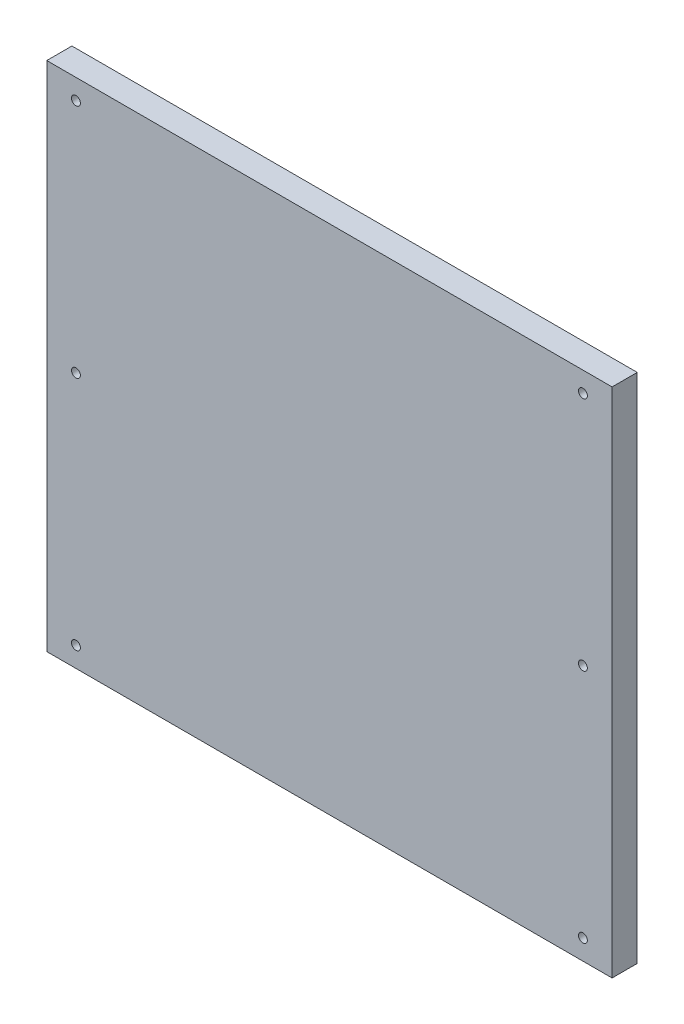
ISO-10303-21;
HEADER;
FILE_DESCRIPTION(('STEP AP214'),'2;1');
FILE_NAME('part.step','',(''),(''),'','','');
FILE_SCHEMA(('AUTOMOTIVE_DESIGN { 1 0 10303 214 1 1 1 1 }'));
ENDSEC;
DATA;
#1=APPLICATION_CONTEXT('core data for automotive mechanical design processes');
#2=APPLICATION_PROTOCOL_DEFINITION('international standard','automotive_design',2000,#1);
#3=PRODUCT_CONTEXT('',#1,'mechanical');
#4=PRODUCT('Part','Part','',(#3));
#5=PRODUCT_RELATED_PRODUCT_CATEGORY('part','',(#4));
#6=PRODUCT_DEFINITION_FORMATION('','',#4);
#7=PRODUCT_DEFINITION_CONTEXT('part definition',#1,'design');
#8=PRODUCT_DEFINITION('design','',#6,#7);
#9=PRODUCT_DEFINITION_SHAPE('','',#8);
#10=(LENGTH_UNIT() NAMED_UNIT(*) SI_UNIT(.MILLI.,.METRE.));
#11=(NAMED_UNIT(*) PLANE_ANGLE_UNIT() SI_UNIT($,.RADIAN.));
#12=(NAMED_UNIT(*) SI_UNIT($,.STERADIAN.) SOLID_ANGLE_UNIT());
#13=UNCERTAINTY_MEASURE_WITH_UNIT(LENGTH_MEASURE(1.E-05),#10,'distance_accuracy_value','');
#14=(GEOMETRIC_REPRESENTATION_CONTEXT(3) GLOBAL_UNCERTAINTY_ASSIGNED_CONTEXT((#13)) GLOBAL_UNIT_ASSIGNED_CONTEXT((#10,
#11,#12)) REPRESENTATION_CONTEXT('',''));
#15=CARTESIAN_POINT('',(0.,0.,0.));
#16=DIRECTION('',(0.,0.,1.));
#17=DIRECTION('',(1.,0.,0.));
#18=AXIS2_PLACEMENT_3D('',#15,#16,#17);
#19=CARTESIAN_POINT('',(214.1125,-146.250000000001,1082.67499999999));
#20=DIRECTION('',(-1.,0.,0.));
#21=DIRECTION('',(0.,0.,1.));
#22=AXIS2_PLACEMENT_3D('',#19,#20,#21);
#23=PLANE('',#22);
#24=DIRECTION('',(0.,1.,0.));
#25=VECTOR('',#24,1.);
#26=CARTESIAN_POINT('',(214.1125,-146.250000000001,1063.62499999999));
#27=LINE('',#26,#25);
#28=CARTESIAN_POINT('',(214.1125,-146.250000000001,1063.62499999999));
#29=VERTEX_POINT('',#28);
#30=CARTESIAN_POINT('',(214.1125,241.5,1063.62499999999));
#31=VERTEX_POINT('',#30);
#32=EDGE_CURVE('E103',#29,#31,#27,.T.);
#33=ORIENTED_EDGE('',*,*,#32,.T.);
#34=DIRECTION('',(0.,0.,-1.));
#35=VECTOR('',#34,1.);
#36=CARTESIAN_POINT('',(214.1125,241.5,1082.67499999999));
#37=LINE('',#36,#35);
#38=CARTESIAN_POINT('',(214.1125,241.5,1082.67499999999));
#39=VERTEX_POINT('',#38);
#40=EDGE_CURVE('E11',#39,#31,#37,.T.);
#41=ORIENTED_EDGE('',*,*,#40,.F.);
#42=DIRECTION('',(0.,1.,0.));
#43=VECTOR('',#42,1.);
#44=CARTESIAN_POINT('',(214.1125,-146.250000000001,1082.67499999999));
#45=LINE('',#44,#43);
#46=CARTESIAN_POINT('',(214.1125,-146.250000000001,1082.67499999999));
#47=VERTEX_POINT('',#46);
#48=EDGE_CURVE('E90',#47,#39,#45,.T.);
#49=ORIENTED_EDGE('',*,*,#48,.F.);
#50=DIRECTION('',(0.,0.,-1.));
#51=VECTOR('',#50,1.);
#52=CARTESIAN_POINT('',(214.1125,-146.250000000001,1082.67499999999));
#53=LINE('',#52,#51);
#54=EDGE_CURVE('E99',#47,#29,#53,.T.);
#55=ORIENTED_EDGE('',*,*,#54,.T.);
#56=EDGE_LOOP('',(#33,#41,#49,#55));
#57=FACE_BOUND('',#56,.T.);
#58=ADVANCED_FACE('F37',(#57),#23,.F.);
#59=CARTESIAN_POINT('',(214.1125,241.5,1082.67499999999));
#60=DIRECTION('',(0.,-1.,0.));
#61=DIRECTION('',(1.,0.,0.));
#62=AXIS2_PLACEMENT_3D('',#59,#60,#61);
#63=PLANE('',#62);
#64=DIRECTION('',(-1.,0.,0.));
#65=VECTOR('',#64,1.);
#66=CARTESIAN_POINT('',(214.1125,241.5,1063.62499999999));
#67=LINE('',#66,#65);
#68=CARTESIAN_POINT('',(-214.11249999999,241.5,1063.62499999999));
#69=VERTEX_POINT('',#68);
#70=EDGE_CURVE('E94',#31,#69,#67,.T.);
#71=ORIENTED_EDGE('',*,*,#70,.T.);
#72=DIRECTION('',(0.,0.,-1.));
#73=VECTOR('',#72,1.);
#74=CARTESIAN_POINT('',(-214.11249999999,241.5,1082.67499999999));
#75=LINE('',#74,#73);
#76=CARTESIAN_POINT('',(-214.11249999999,241.5,1082.67499999999));
#77=VERTEX_POINT('',#76);
#78=EDGE_CURVE('E46',#77,#69,#75,.T.);
#79=ORIENTED_EDGE('',*,*,#78,.F.);
#80=DIRECTION('',(-1.,0.,0.));
#81=VECTOR('',#80,1.);
#82=CARTESIAN_POINT('',(214.1125,241.5,1082.67499999999));
#83=LINE('',#82,#81);
#84=EDGE_CURVE('E85',#39,#77,#83,.T.);
#85=ORIENTED_EDGE('',*,*,#84,.F.);
#86=ORIENTED_EDGE('',*,*,#40,.T.);
#87=EDGE_LOOP('',(#71,#79,#85,#86));
#88=FACE_BOUND('',#87,.T.);
#89=ADVANCED_FACE('F93',(#88),#63,.F.);
#90=CARTESIAN_POINT('',(-214.112499999991,-146.250000000001,1082.67499999999));
#91=DIRECTION('',(1.,0.,0.));
#92=DIRECTION('',(0.,1.,0.));
#93=AXIS2_PLACEMENT_3D('',#90,#91,#92);
#94=PLANE('',#93);
#95=DIRECTION('',(0.,-1.,0.));
#96=VECTOR('',#95,1.);
#97=CARTESIAN_POINT('',(-214.112499999991,-146.250000000001,1063.62499999999));
#98=LINE('',#97,#96);
#99=CARTESIAN_POINT('',(-214.112499999991,-146.250000000001,1063.62499999999));
#100=VERTEX_POINT('',#99);
#101=EDGE_CURVE('E72',#69,#100,#98,.T.);
#102=ORIENTED_EDGE('',*,*,#101,.T.);
#103=DIRECTION('',(0.,0.,-1.));
#104=VECTOR('',#103,1.);
#105=CARTESIAN_POINT('',(-214.112499999991,-146.250000000001,1082.67499999999));
#106=LINE('',#105,#104);
#107=CARTESIAN_POINT('',(-214.112499999991,-146.250000000001,1082.67499999999));
#108=VERTEX_POINT('',#107);
#109=EDGE_CURVE('E95',#108,#100,#106,.T.);
#110=ORIENTED_EDGE('',*,*,#109,.F.);
#111=DIRECTION('',(0.,-1.,0.));
#112=VECTOR('',#111,1.);
#113=CARTESIAN_POINT('',(-214.112499999991,-146.250000000001,1082.67499999999));
#114=LINE('',#113,#112);
#115=EDGE_CURVE('E88',#77,#108,#114,.T.);
#116=ORIENTED_EDGE('',*,*,#115,.F.);
#117=ORIENTED_EDGE('',*,*,#78,.T.);
#118=EDGE_LOOP('',(#102,#110,#116,#117));
#119=FACE_BOUND('',#118,.T.);
#120=ADVANCED_FACE('F97',(#119),#94,.F.);
#121=CARTESIAN_POINT('',(214.1125,-146.250000000001,1082.67499999999));
#122=DIRECTION('',(0.,1.,0.));
#123=DIRECTION('',(-1.,0.,0.));
#124=AXIS2_PLACEMENT_3D('',#121,#122,#123);
#125=PLANE('',#124);
#126=DIRECTION('',(1.,0.,0.));
#127=VECTOR('',#126,1.);
#128=CARTESIAN_POINT('',(214.1125,-146.250000000001,1063.62499999999));
#129=LINE('',#128,#127);
#130=EDGE_CURVE('E78',#100,#29,#129,.T.);
#131=ORIENTED_EDGE('',*,*,#130,.T.);
#132=ORIENTED_EDGE('',*,*,#54,.F.);
#133=DIRECTION('',(1.,0.,0.));
#134=VECTOR('',#133,1.);
#135=CARTESIAN_POINT('',(214.1125,-146.250000000001,1082.67499999999));
#136=LINE('',#135,#134);
#137=EDGE_CURVE('E55',#108,#47,#136,.T.);
#138=ORIENTED_EDGE('',*,*,#137,.F.);
#139=ORIENTED_EDGE('',*,*,#109,.T.);
#140=EDGE_LOOP('',(#131,#132,#138,#139));
#141=FACE_BOUND('',#140,.T.);
#142=ADVANCED_FACE('F163',(#141),#125,.F.);
#143=CARTESIAN_POINT('',(0.,0.,1082.67499999999));
#144=DIRECTION('',(0.,0.,1.));
#145=DIRECTION('',(1.,0.,0.));
#146=AXIS2_PLACEMENT_3D('',#143,#144,#145);
#147=PLANE('',#146);
#148=CARTESIAN_POINT('',(-192.0145,226.259999999998,1082.67499999999));
#149=DIRECTION('',(0.,0.,1.));
#150=DIRECTION('',(1.,0.,0.));
#151=AXIS2_PLACEMENT_3D('',#148,#149,#150);
#152=CIRCLE('',#151,3.36549999999999);
#153=CARTESIAN_POINT('',(-188.649,226.259999999998,1082.67499999999));
#154=VERTEX_POINT('',#153);
#155=EDGE_CURVE('E134',#154,#154,#152,.F.);
#156=ORIENTED_EDGE('',*,*,#155,.T.);
#157=EDGE_LOOP('',(#156));
#158=FACE_BOUND('',#157,.T.);
#159=CARTESIAN_POINT('',(-192.0145,47.6249999999972,1082.67499999999));
#160=DIRECTION('',(0.,0.,1.));
#161=DIRECTION('',(0.,1.,0.));
#162=AXIS2_PLACEMENT_3D('',#159,#160,#161);
#163=CIRCLE('',#162,3.36549999999999);
#164=CARTESIAN_POINT('',(-192.0145,50.9904999999972,1082.67499999999));
#165=VERTEX_POINT('',#164);
#166=EDGE_CURVE('E128',#165,#165,#163,.T.);
#167=ORIENTED_EDGE('',*,*,#166,.F.);
#168=EDGE_LOOP('',(#167));
#169=FACE_BOUND('',#168,.T.);
#170=CARTESIAN_POINT('',(-192.0145,-131.010000000003,1082.67499999999));
#171=DIRECTION('',(0.,0.,1.));
#172=DIRECTION('',(0.,1.,0.));
#173=AXIS2_PLACEMENT_3D('',#170,#171,#172);
#174=CIRCLE('',#173,3.36550000000005);
#175=CARTESIAN_POINT('',(-192.0145,-127.644500000003,1082.67499999999));
#176=VERTEX_POINT('',#175);
#177=EDGE_CURVE('E125',#176,#176,#174,.T.);
#178=ORIENTED_EDGE('',*,*,#177,.F.);
#179=EDGE_LOOP('',(#178));
#180=FACE_BOUND('',#179,.T.);
#181=CARTESIAN_POINT('',(192.0145,226.259999999998,1082.67499999999));
#182=DIRECTION('',(0.,0.,1.));
#183=DIRECTION('',(1.,0.,0.));
#184=AXIS2_PLACEMENT_3D('',#181,#182,#183);
#185=CIRCLE('',#184,3.36549999999999);
#186=CARTESIAN_POINT('',(195.38,226.259999999998,1082.67499999999));
#187=VERTEX_POINT('',#186);
#188=EDGE_CURVE('E122',#187,#187,#185,.T.);
#189=ORIENTED_EDGE('',*,*,#188,.F.);
#190=EDGE_LOOP('',(#189));
#191=FACE_BOUND('',#190,.T.);
#192=CARTESIAN_POINT('',(192.0145,47.6249999999972,1082.67499999999));
#193=DIRECTION('',(0.,0.,-1.));
#194=DIRECTION('',(0.,1.,0.));
#195=AXIS2_PLACEMENT_3D('',#192,#193,#194);
#196=CIRCLE('',#195,3.36549999999999);
#197=CARTESIAN_POINT('',(192.0145,50.9904999999972,1082.67499999999));
#198=VERTEX_POINT('',#197);
#199=EDGE_CURVE('E118',#198,#198,#196,.T.);
#200=ORIENTED_EDGE('',*,*,#199,.T.);
#201=EDGE_LOOP('',(#200));
#202=FACE_BOUND('',#201,.T.);
#203=CARTESIAN_POINT('',(192.0145,-131.010000000003,1082.67499999999));
#204=DIRECTION('',(0.,0.,-1.));
#205=DIRECTION('',(0.,1.,0.));
#206=AXIS2_PLACEMENT_3D('',#203,#204,#205);
#207=CIRCLE('',#206,3.36550000000005);
#208=CARTESIAN_POINT('',(192.0145,-127.644500000003,1082.67499999999));
#209=VERTEX_POINT('',#208);
#210=EDGE_CURVE('E114',#209,#209,#207,.T.);
#211=ORIENTED_EDGE('',*,*,#210,.T.);
#212=EDGE_LOOP('',(#211));
#213=FACE_BOUND('',#212,.T.);
#214=ORIENTED_EDGE('',*,*,#48,.T.);
#215=ORIENTED_EDGE('',*,*,#84,.T.);
#216=ORIENTED_EDGE('',*,*,#115,.T.);
#217=ORIENTED_EDGE('',*,*,#137,.T.);
#218=EDGE_LOOP('',(#214,#215,#216,#217));
#219=FACE_BOUND('',#218,.T.);
#220=ADVANCED_FACE('F86',(#158,#169,#180,#191,#202,#213,#219),#147,.T.);
#221=CARTESIAN_POINT('',(0.,0.,1063.62499999999));
#222=DIRECTION('',(0.,0.,1.));
#223=DIRECTION('',(1.,0.,0.));
#224=AXIS2_PLACEMENT_3D('',#221,#222,#223);
#225=PLANE('',#224);
#226=CARTESIAN_POINT('',(-192.0145,226.259999999998,1063.62499999999));
#227=DIRECTION('',(0.,0.,1.));
#228=DIRECTION('',(1.,0.,0.));
#229=AXIS2_PLACEMENT_3D('',#226,#227,#228);
#230=CIRCLE('',#229,3.36549999999999);
#231=CARTESIAN_POINT('',(-188.649,226.259999999998,1063.62499999999));
#232=VERTEX_POINT('',#231);
#233=EDGE_CURVE('E40',#232,#232,#230,.F.);
#234=ORIENTED_EDGE('',*,*,#233,.F.);
#235=EDGE_LOOP('',(#234));
#236=FACE_BOUND('',#235,.T.);
#237=CARTESIAN_POINT('',(-192.0145,47.6249999999973,1063.62499999999));
#238=DIRECTION('',(0.,0.,1.));
#239=DIRECTION('',(1.,0.,0.));
#240=AXIS2_PLACEMENT_3D('',#237,#238,#239);
#241=CIRCLE('',#240,3.36549999999999);
#242=CARTESIAN_POINT('',(-188.649,47.6249999999973,1063.62499999999));
#243=VERTEX_POINT('',#242);
#244=EDGE_CURVE('E126',#243,#243,#241,.F.);
#245=ORIENTED_EDGE('',*,*,#244,.F.);
#246=EDGE_LOOP('',(#245));
#247=FACE_BOUND('',#246,.T.);
#248=CARTESIAN_POINT('',(-192.0145,-131.010000000003,1063.62499999999));
#249=DIRECTION('',(0.,0.,1.));
#250=DIRECTION('',(1.,0.,0.));
#251=AXIS2_PLACEMENT_3D('',#248,#249,#250);
#252=CIRCLE('',#251,3.36550000000005);
#253=CARTESIAN_POINT('',(-188.649,-131.010000000003,1063.62499999999));
#254=VERTEX_POINT('',#253);
#255=EDGE_CURVE('E123',#254,#254,#252,.F.);
#256=ORIENTED_EDGE('',*,*,#255,.F.);
#257=EDGE_LOOP('',(#256));
#258=FACE_BOUND('',#257,.T.);
#259=CARTESIAN_POINT('',(192.0145,226.259999999998,1063.62499999999));
#260=DIRECTION('',(0.,0.,1.));
#261=DIRECTION('',(1.,0.,0.));
#262=AXIS2_PLACEMENT_3D('',#259,#260,#261);
#263=CIRCLE('',#262,3.36549999999999);
#264=CARTESIAN_POINT('',(195.38,226.259999999998,1063.62499999999));
#265=VERTEX_POINT('',#264);
#266=EDGE_CURVE('E119',#265,#265,#263,.T.);
#267=ORIENTED_EDGE('',*,*,#266,.T.);
#268=EDGE_LOOP('',(#267));
#269=FACE_BOUND('',#268,.T.);
#270=CARTESIAN_POINT('',(192.0145,47.6249999999973,1063.62499999999));
#271=DIRECTION('',(0.,0.,1.));
#272=DIRECTION('',(1.,0.,0.));
#273=AXIS2_PLACEMENT_3D('',#270,#271,#272);
#274=CIRCLE('',#273,3.36549999999999);
#275=CARTESIAN_POINT('',(192.0145,50.9904999999973,1063.62499999999));
#276=VERTEX_POINT('',#275);
#277=EDGE_CURVE('E115',#276,#276,#274,.T.);
#278=ORIENTED_EDGE('',*,*,#277,.T.);
#279=EDGE_LOOP('',(#278));
#280=FACE_BOUND('',#279,.T.);
#281=CARTESIAN_POINT('',(192.0145,-131.010000000003,1063.62499999999));
#282=DIRECTION('',(0.,0.,1.));
#283=DIRECTION('',(1.,0.,0.));
#284=AXIS2_PLACEMENT_3D('',#281,#282,#283);
#285=CIRCLE('',#284,3.36550000000005);
#286=CARTESIAN_POINT('',(195.38,-131.010000000003,1063.62499999999));
#287=VERTEX_POINT('',#286);
#288=EDGE_CURVE('E106',#287,#287,#285,.T.);
#289=ORIENTED_EDGE('',*,*,#288,.T.);
#290=EDGE_LOOP('',(#289));
#291=FACE_BOUND('',#290,.T.);
#292=ORIENTED_EDGE('',*,*,#32,.F.);
#293=ORIENTED_EDGE('',*,*,#130,.F.);
#294=ORIENTED_EDGE('',*,*,#101,.F.);
#295=ORIENTED_EDGE('',*,*,#70,.F.);
#296=EDGE_LOOP('',(#292,#293,#294,#295));
#297=FACE_BOUND('',#296,.T.);
#298=ADVANCED_FACE('F153',(#236,#247,#258,#269,#280,#291,#297),#225,.F.);
#299=CARTESIAN_POINT('',(192.0145,-131.010000000003,1082.67499999999));
#300=DIRECTION('',(0.,0.,-1.));
#301=DIRECTION('',(0.,1.,0.));
#302=AXIS2_PLACEMENT_3D('',#299,#300,#301);
#303=CYLINDRICAL_SURFACE('',#302,3.36550000000005);
#304=ORIENTED_EDGE('',*,*,#210,.F.);
#305=EDGE_LOOP('',(#304));
#306=FACE_BOUND('',#305,.T.);
#307=ORIENTED_EDGE('',*,*,#288,.F.);
#308=EDGE_LOOP('',(#307));
#309=FACE_BOUND('',#308,.T.);
#310=ADVANCED_FACE('F149',(#306,#309),#303,.F.);
#311=CARTESIAN_POINT('',(192.0145,47.6249999999972,1082.67499999999));
#312=DIRECTION('',(0.,0.,-1.));
#313=DIRECTION('',(0.,1.,0.));
#314=AXIS2_PLACEMENT_3D('',#311,#312,#313);
#315=CYLINDRICAL_SURFACE('',#314,3.36549999999999);
#316=CARTESIAN_POINT('',(192.0145,50.9904999999972,1082.67499999999));
#317=CARTESIAN_POINT('',(192.0145,50.9904999999972,1082.47656249999));
#318=CARTESIAN_POINT('',(192.0145,50.9904999999972,1082.27812499999));
#319=CARTESIAN_POINT('',(192.0145,50.9904999999972,1081.88124999999));
#320=CARTESIAN_POINT('',(192.0145,50.9904999999972,1081.68281249999));
#321=CARTESIAN_POINT('',(192.0145,50.9904999999972,1081.28593749999));
#322=CARTESIAN_POINT('',(192.0145,50.9904999999972,1081.08749999999));
#323=CARTESIAN_POINT('',(192.0145,50.9904999999972,1080.69062499999));
#324=CARTESIAN_POINT('',(192.0145,50.9904999999972,1080.49218749999));
#325=CARTESIAN_POINT('',(192.0145,50.9904999999972,1080.09531249999));
#326=CARTESIAN_POINT('',(192.0145,50.9904999999972,1079.89687499999));
#327=CARTESIAN_POINT('',(192.0145,50.9904999999972,1079.49999999999));
#328=CARTESIAN_POINT('',(192.0145,50.9904999999972,1079.30156249999));
#329=CARTESIAN_POINT('',(192.0145,50.9904999999972,1078.90468749999));
#330=CARTESIAN_POINT('',(192.0145,50.9904999999972,1078.70624999999));
#331=CARTESIAN_POINT('',(192.0145,50.9904999999972,1078.30937499999));
#332=CARTESIAN_POINT('',(192.0145,50.9904999999972,1078.11093749999));
#333=CARTESIAN_POINT('',(192.0145,50.9904999999972,1077.71406249999));
#334=CARTESIAN_POINT('',(192.0145,50.9904999999972,1077.51562499999));
#335=CARTESIAN_POINT('',(192.0145,50.9904999999972,1077.11874999999));
#336=CARTESIAN_POINT('',(192.0145,50.9904999999972,1076.92031249999));
#337=CARTESIAN_POINT('',(192.0145,50.9904999999972,1076.52343749999));
#338=CARTESIAN_POINT('',(192.0145,50.9904999999972,1076.32499999999));
#339=CARTESIAN_POINT('',(192.0145,50.9904999999972,1075.92812499999));
#340=CARTESIAN_POINT('',(192.0145,50.9904999999972,1075.72968749999));
#341=CARTESIAN_POINT('',(192.0145,50.9904999999972,1075.33281249999));
#342=CARTESIAN_POINT('',(192.0145,50.9904999999972,1075.13437499999));
#343=CARTESIAN_POINT('',(192.0145,50.9904999999972,1074.73749999999));
#344=CARTESIAN_POINT('',(192.0145,50.9904999999972,1074.53906249999));
#345=CARTESIAN_POINT('',(192.0145,50.9904999999972,1074.14218749999));
#346=CARTESIAN_POINT('',(192.0145,50.9904999999972,1073.94374999999));
#347=CARTESIAN_POINT('',(192.0145,50.9904999999972,1073.54687499999));
#348=CARTESIAN_POINT('',(192.0145,50.9904999999972,1073.34843749999));
#349=CARTESIAN_POINT('',(192.0145,50.9904999999972,1072.95156249999));
#350=CARTESIAN_POINT('',(192.0145,50.9904999999972,1072.75312499999));
#351=CARTESIAN_POINT('',(192.0145,50.9904999999972,1072.35624999999));
#352=CARTESIAN_POINT('',(192.0145,50.9904999999972,1072.15781249999));
#353=CARTESIAN_POINT('',(192.0145,50.9904999999972,1071.76093749999));
#354=CARTESIAN_POINT('',(192.0145,50.9904999999972,1071.56249999999));
#355=CARTESIAN_POINT('',(192.0145,50.9904999999972,1071.16562499999));
#356=CARTESIAN_POINT('',(192.0145,50.9904999999972,1070.96718749999));
#357=CARTESIAN_POINT('',(192.0145,50.9904999999972,1070.57031249999));
#358=CARTESIAN_POINT('',(192.0145,50.9904999999972,1070.37187499999));
#359=CARTESIAN_POINT('',(192.0145,50.9904999999972,1069.97499999999));
#360=CARTESIAN_POINT('',(192.0145,50.9904999999973,1069.77656249999));
#361=CARTESIAN_POINT('',(192.0145,50.9904999999973,1069.37968749999));
#362=CARTESIAN_POINT('',(192.0145,50.9904999999973,1069.18124999999));
#363=CARTESIAN_POINT('',(192.0145,50.9904999999973,1068.78437499999));
#364=CARTESIAN_POINT('',(192.0145,50.9904999999973,1068.58593749999));
#365=CARTESIAN_POINT('',(192.0145,50.9904999999973,1068.18906249999));
#366=CARTESIAN_POINT('',(192.0145,50.9904999999973,1067.99062499999));
#367=CARTESIAN_POINT('',(192.0145,50.9904999999973,1067.59374999999));
#368=CARTESIAN_POINT('',(192.0145,50.9904999999973,1067.39531249999));
#369=CARTESIAN_POINT('',(192.0145,50.9904999999973,1066.99843749999));
#370=CARTESIAN_POINT('',(192.0145,50.9904999999973,1066.79999999999));
#371=CARTESIAN_POINT('',(192.0145,50.9904999999973,1066.40312499999));
#372=CARTESIAN_POINT('',(192.0145,50.9904999999973,1066.20468749999));
#373=CARTESIAN_POINT('',(192.0145,50.9904999999973,1065.80781249999));
#374=CARTESIAN_POINT('',(192.0145,50.9904999999973,1065.60937499999));
#375=CARTESIAN_POINT('',(192.0145,50.9904999999973,1065.21249999999));
#376=CARTESIAN_POINT('',(192.0145,50.9904999999973,1065.01406249999));
#377=CARTESIAN_POINT('',(192.0145,50.9904999999973,1064.61718749999));
#378=CARTESIAN_POINT('',(192.0145,50.9904999999973,1064.41874999999));
#379=CARTESIAN_POINT('',(192.0145,50.9904999999973,1064.02187499999));
#380=CARTESIAN_POINT('',(192.0145,50.9904999999973,1063.82343749999));
#381=CARTESIAN_POINT('',(192.0145,50.9904999999973,1063.62499999999));
#382=B_SPLINE_CURVE_WITH_KNOTS('',3,(#316,#317,#318,#319,#320,#321,#322,#323,#324,#325,#326,
#327,#328,#329,#330,#331,#332,#333,#334,#335,#336,#337,#338,#339,#340,#341,#342,#343,#344,#345,
#346,#347,#348,#349,#350,#351,#352,#353,#354,#355,#356,#357,#358,#359,#360,#361,#362,#363,#364,
#365,#366,#367,#368,#369,#370,#371,#372,#373,#374,#375,#376,#377,#378,#379,#380,#381),
.UNSPECIFIED.,.F.,.F.,(4,2,2,2,2,2,2,2,2,2,2,2,2,2,2,2,2,2,2,2,2,2,2,2,2,2,2,2,2,2,2,2,4),(0.,
0.5953125,1.190625,1.7859375,2.38125,2.9765625,3.571875,4.1671875,4.7625,5.3578125,5.953125,
6.54843750000023,7.14375000000023,7.73906250000023,8.33437500000023,8.92968750000023,
9.52500000000023,10.1203125000002,10.7156250000002,11.3109375000002,11.9062500000002,
12.5015625000002,13.0968750000005,13.6921875000005,14.2875000000005,14.8828125000005,
15.4781250000005,16.0734375000005,16.6687500000005,17.2640625000005,17.8593750000005,
18.4546875000005,19.0500000000007),.UNSPECIFIED.);
#383=EDGE_CURVE('BSEAM152',#198,#276,#382,.T.);
#384=ORIENTED_EDGE('',*,*,#199,.F.);
#385=ORIENTED_EDGE('',*,*,#277,.F.);
#386=ORIENTED_EDGE('',*,*,#383,.T.);
#387=ORIENTED_EDGE('',*,*,#383,.F.);
#388=EDGE_LOOP('',(#384,#386,#385,#387));
#389=FACE_BOUND('',#388,.T.);
#390=ADVANCED_FACE('F152',(#389),#315,.F.);
#391=CARTESIAN_POINT('',(192.0145,226.259999999998,1087.11999999999));
#392=DIRECTION('',(0.,0.,-1.));
#393=DIRECTION('',(0.,1.,0.));
#394=AXIS2_PLACEMENT_3D('',#391,#392,#393);
#395=CYLINDRICAL_SURFACE('',#394,3.36549999999999);
#396=ORIENTED_EDGE('',*,*,#188,.T.);
#397=EDGE_LOOP('',(#396));
#398=FACE_BOUND('',#397,.T.);
#399=ORIENTED_EDGE('',*,*,#266,.F.);
#400=EDGE_LOOP('',(#399));
#401=FACE_BOUND('',#400,.T.);
#402=ADVANCED_FACE('F207',(#398,#401),#395,.F.);
#403=CARTESIAN_POINT('',(-192.0145,-131.010000000003,1082.67499999999));
#404=DIRECTION('',(0.,0.,-1.));
#405=DIRECTION('',(0.,1.,0.));
#406=AXIS2_PLACEMENT_3D('',#403,#404,#405);
#407=CYLINDRICAL_SURFACE('',#406,3.36550000000005);
#408=ORIENTED_EDGE('',*,*,#177,.T.);
#409=EDGE_LOOP('',(#408));
#410=FACE_BOUND('',#409,.T.);
#411=ORIENTED_EDGE('',*,*,#255,.T.);
#412=EDGE_LOOP('',(#411));
#413=FACE_BOUND('',#412,.T.);
#414=ADVANCED_FACE('F218',(#410,#413),#407,.F.);
#415=CARTESIAN_POINT('',(-192.0145,47.6249999999972,1082.67499999999));
#416=DIRECTION('',(0.,0.,-1.));
#417=DIRECTION('',(0.,1.,0.));
#418=AXIS2_PLACEMENT_3D('',#415,#416,#417);
#419=CYLINDRICAL_SURFACE('',#418,3.36549999999999);
#420=ORIENTED_EDGE('',*,*,#166,.T.);
#421=EDGE_LOOP('',(#420));
#422=FACE_BOUND('',#421,.T.);
#423=ORIENTED_EDGE('',*,*,#244,.T.);
#424=EDGE_LOOP('',(#423));
#425=FACE_BOUND('',#424,.T.);
#426=ADVANCED_FACE('F241',(#422,#425),#419,.F.);
#427=CARTESIAN_POINT('',(-192.0145,226.259999999998,1087.11999999999));
#428=DIRECTION('',(0.,0.,-1.));
#429=DIRECTION('',(0.,1.,0.));
#430=AXIS2_PLACEMENT_3D('',#427,#428,#429);
#431=CYLINDRICAL_SURFACE('',#430,3.36549999999999);
#432=ORIENTED_EDGE('',*,*,#155,.F.);
#433=EDGE_LOOP('',(#432));
#434=FACE_BOUND('',#433,.T.);
#435=ORIENTED_EDGE('',*,*,#233,.T.);
#436=EDGE_LOOP('',(#435));
#437=FACE_BOUND('',#436,.T.);
#438=ADVANCED_FACE('F252',(#434,#437),#431,.F.);
#439=CLOSED_SHELL('',(#58,#89,#120,#142,#220,#298,#310,#390,#402,#414,#426,#438));
#440=MANIFOLD_SOLID_BREP('B2',#439);
#441=ADVANCED_BREP_SHAPE_REPRESENTATION('',(#18,#440),#14);
#442=SHAPE_DEFINITION_REPRESENTATION(#9,#441);
ENDSEC;
END-ISO-10303-21;
